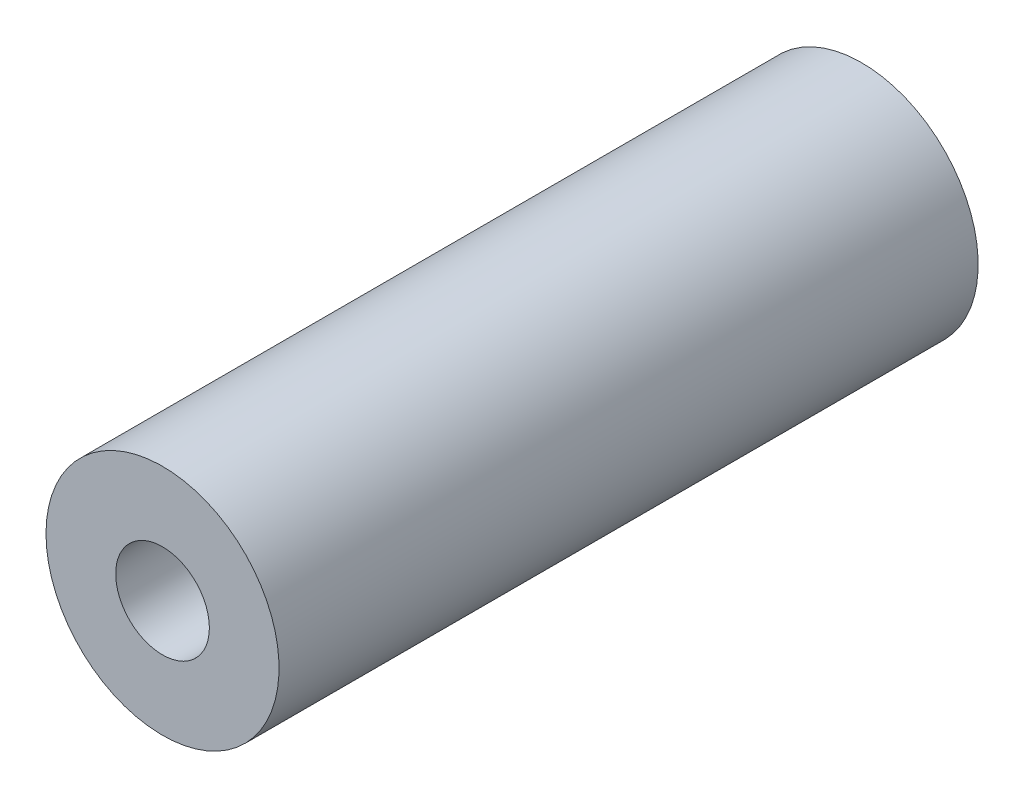
ISO-10303-21;
HEADER;
FILE_DESCRIPTION(('STEP AP214'),'2;1');
FILE_NAME('part.step','',(''),(''),'','','');
FILE_SCHEMA(('AUTOMOTIVE_DESIGN { 1 0 10303 214 1 1 1 1 }'));
ENDSEC;
DATA;
#1=APPLICATION_CONTEXT('core data for automotive mechanical design processes');
#2=APPLICATION_PROTOCOL_DEFINITION('international standard','automotive_design',2000,#1);
#3=PRODUCT_CONTEXT('',#1,'mechanical');
#4=PRODUCT('Part','Part','',(#3));
#5=PRODUCT_RELATED_PRODUCT_CATEGORY('part','',(#4));
#6=PRODUCT_DEFINITION_FORMATION('','',#4);
#7=PRODUCT_DEFINITION_CONTEXT('part definition',#1,'design');
#8=PRODUCT_DEFINITION('design','',#6,#7);
#9=PRODUCT_DEFINITION_SHAPE('','',#8);
#10=(LENGTH_UNIT() NAMED_UNIT(*) SI_UNIT(.MILLI.,.METRE.));
#11=(NAMED_UNIT(*) PLANE_ANGLE_UNIT() SI_UNIT($,.RADIAN.));
#12=(NAMED_UNIT(*) SI_UNIT($,.STERADIAN.) SOLID_ANGLE_UNIT());
#13=UNCERTAINTY_MEASURE_WITH_UNIT(LENGTH_MEASURE(1.E-05),#10,'distance_accuracy_value','');
#14=(GEOMETRIC_REPRESENTATION_CONTEXT(3) GLOBAL_UNCERTAINTY_ASSIGNED_CONTEXT((#13)) GLOBAL_UNIT_ASSIGNED_CONTEXT((#10,
#11,#12)) REPRESENTATION_CONTEXT('',''));
#15=CARTESIAN_POINT('',(0.,0.,0.));
#16=DIRECTION('',(0.,0.,1.));
#17=DIRECTION('',(1.,0.,0.));
#18=AXIS2_PLACEMENT_3D('',#15,#16,#17);
#19=CARTESIAN_POINT('',(0.,0.,38.1));
#20=DIRECTION('',(0.,0.,-1.));
#21=DIRECTION('',(-1.,0.,0.));
#22=AXIS2_PLACEMENT_3D('',#19,#20,#21);
#23=CYLINDRICAL_SURFACE('',#22,6.35);
#24=CARTESIAN_POINT('',(0.,0.,38.1));
#25=DIRECTION('',(0.,0.,1.));
#26=DIRECTION('',(1.,0.,0.));
#27=AXIS2_PLACEMENT_3D('',#24,#25,#26);
#28=CIRCLE('',#27,6.35);
#29=CARTESIAN_POINT('',(-6.35,0.,38.1));
#30=VERTEX_POINT('',#29);
#31=EDGE_CURVE('E10',#30,#30,#28,.T.);
#32=CARTESIAN_POINT('',(0.,0.,0.));
#33=DIRECTION('',(0.,0.,1.));
#34=DIRECTION('',(1.,0.,0.));
#35=AXIS2_PLACEMENT_3D('',#32,#33,#34);
#36=CIRCLE('',#35,6.35);
#37=CARTESIAN_POINT('',(-6.35,0.,0.));
#38=VERTEX_POINT('',#37);
#39=EDGE_CURVE('E45',#38,#38,#36,.T.);
#40=CARTESIAN_POINT('',(-6.35,0.,38.1));
#41=CARTESIAN_POINT('',(-6.35,0.,37.703125));
#42=CARTESIAN_POINT('',(-6.35,0.,37.30625));
#43=CARTESIAN_POINT('',(-6.35,0.,36.5125));
#44=CARTESIAN_POINT('',(-6.35,0.,36.115625));
#45=CARTESIAN_POINT('',(-6.35,0.,35.321875));
#46=CARTESIAN_POINT('',(-6.35,0.,34.925));
#47=CARTESIAN_POINT('',(-6.35,0.,34.13125));
#48=CARTESIAN_POINT('',(-6.35,0.,33.734375));
#49=CARTESIAN_POINT('',(-6.35,0.,32.940625));
#50=CARTESIAN_POINT('',(-6.35,0.,32.54375));
#51=CARTESIAN_POINT('',(-6.35,0.,31.75));
#52=CARTESIAN_POINT('',(-6.35,0.,31.353125));
#53=CARTESIAN_POINT('',(-6.35,0.,30.559375));
#54=CARTESIAN_POINT('',(-6.35,0.,30.1625));
#55=CARTESIAN_POINT('',(-6.35,0.,29.36875));
#56=CARTESIAN_POINT('',(-6.35,0.,28.971875));
#57=CARTESIAN_POINT('',(-6.35,0.,28.178125));
#58=CARTESIAN_POINT('',(-6.35,0.,27.78125));
#59=CARTESIAN_POINT('',(-6.35,0.,26.9875));
#60=CARTESIAN_POINT('',(-6.35,0.,26.590625));
#61=CARTESIAN_POINT('',(-6.35,0.,25.796875));
#62=CARTESIAN_POINT('',(-6.35,0.,25.4));
#63=CARTESIAN_POINT('',(-6.35,0.,24.60625));
#64=CARTESIAN_POINT('',(-6.35,0.,24.209375));
#65=CARTESIAN_POINT('',(-6.35,0.,23.415625));
#66=CARTESIAN_POINT('',(-6.35,0.,23.01875));
#67=CARTESIAN_POINT('',(-6.35,0.,22.225));
#68=CARTESIAN_POINT('',(-6.35,0.,21.828125));
#69=CARTESIAN_POINT('',(-6.35,0.,21.034375));
#70=CARTESIAN_POINT('',(-6.35,0.,20.6375));
#71=CARTESIAN_POINT('',(-6.35,0.,19.84375));
#72=CARTESIAN_POINT('',(-6.35,0.,19.446875));
#73=CARTESIAN_POINT('',(-6.35,0.,18.653125));
#74=CARTESIAN_POINT('',(-6.35,0.,18.25625));
#75=CARTESIAN_POINT('',(-6.35,0.,17.4625));
#76=CARTESIAN_POINT('',(-6.35,0.,17.065625));
#77=CARTESIAN_POINT('',(-6.35,0.,16.271875));
#78=CARTESIAN_POINT('',(-6.35,0.,15.875));
#79=CARTESIAN_POINT('',(-6.35,0.,15.08125));
#80=CARTESIAN_POINT('',(-6.35,0.,14.684375));
#81=CARTESIAN_POINT('',(-6.35,0.,13.890625));
#82=CARTESIAN_POINT('',(-6.35,0.,13.49375));
#83=CARTESIAN_POINT('',(-6.35,0.,12.7));
#84=CARTESIAN_POINT('',(-6.35,0.,12.303125));
#85=CARTESIAN_POINT('',(-6.35,0.,11.509375));
#86=CARTESIAN_POINT('',(-6.35,0.,11.1125));
#87=CARTESIAN_POINT('',(-6.35,0.,10.31875));
#88=CARTESIAN_POINT('',(-6.35,0.,9.921875));
#89=CARTESIAN_POINT('',(-6.35,0.,9.128125));
#90=CARTESIAN_POINT('',(-6.35,0.,8.73125));
#91=CARTESIAN_POINT('',(-6.35,0.,7.9375));
#92=CARTESIAN_POINT('',(-6.35,0.,7.540625));
#93=CARTESIAN_POINT('',(-6.35,0.,6.746875));
#94=CARTESIAN_POINT('',(-6.35,0.,6.35));
#95=CARTESIAN_POINT('',(-6.35,0.,5.55625));
#96=CARTESIAN_POINT('',(-6.35,0.,5.159375));
#97=CARTESIAN_POINT('',(-6.35,0.,4.365625));
#98=CARTESIAN_POINT('',(-6.35,0.,3.96875));
#99=CARTESIAN_POINT('',(-6.35,0.,3.175));
#100=CARTESIAN_POINT('',(-6.35,0.,2.778125));
#101=CARTESIAN_POINT('',(-6.35,0.,1.984375));
#102=CARTESIAN_POINT('',(-6.35,0.,1.5875));
#103=CARTESIAN_POINT('',(-6.35,0.,0.79375));
#104=CARTESIAN_POINT('',(-6.35,0.,0.396875));
#105=CARTESIAN_POINT('',(-6.35,0.,0.));
#106=B_SPLINE_CURVE_WITH_KNOTS('',3,(#40,#41,#42,#43,#44,#45,#46,#47,#48,#49,#50,#51,#52,#53,
#54,#55,#56,#57,#58,#59,#60,#61,#62,#63,#64,#65,#66,#67,#68,#69,#70,#71,#72,#73,#74,#75,#76,#77,
#78,#79,#80,#81,#82,#83,#84,#85,#86,#87,#88,#89,#90,#91,#92,#93,#94,#95,#96,#97,#98,#99,#100,
#101,#102,#103,#104,#105),.UNSPECIFIED.,.F.,.F.,(4,2,2,2,2,2,2,2,2,2,2,2,2,2,2,2,2,2,2,2,2,2,2,
2,2,2,2,2,2,2,2,2,4),(0.,1.19062499999999,2.38124999999999,3.571875,4.7625,5.953125,7.14375,
8.33437499999999,9.525,10.715625,11.90625,13.096875,14.2875,15.478125,16.66875,17.859375,19.05,
20.240625,21.43125,22.621875,23.8125,25.003125,26.19375,27.384375,28.575,29.765625,30.95625,
32.146875,33.3375,34.528125,35.71875,36.909375,38.1),.UNSPECIFIED.);
#107=EDGE_CURVE('BSEAM42',#30,#38,#106,.T.);
#108=ORIENTED_EDGE('',*,*,#31,.F.);
#109=ORIENTED_EDGE('',*,*,#39,.T.);
#110=ORIENTED_EDGE('',*,*,#107,.T.);
#111=ORIENTED_EDGE('',*,*,#107,.F.);
#112=EDGE_LOOP('',(#108,#110,#109,#111));
#113=FACE_BOUND('',#112,.T.);
#114=ADVANCED_FACE('F42',(#113),#23,.T.);
#115=CARTESIAN_POINT('',(0.,0.,38.1));
#116=DIRECTION('',(0.,0.,1.));
#117=DIRECTION('',(1.,0.,0.));
#118=AXIS2_PLACEMENT_3D('',#115,#116,#117);
#119=PLANE('',#118);
#120=CARTESIAN_POINT('',(0.,0.,38.1));
#121=DIRECTION('',(0.,0.,1.));
#122=DIRECTION('',(1.,0.,0.));
#123=AXIS2_PLACEMENT_3D('',#120,#121,#122);
#124=CIRCLE('',#123,2.55269999999999);
#125=CARTESIAN_POINT('',(2.55269999999999,0.,38.1));
#126=VERTEX_POINT('',#125);
#127=EDGE_CURVE('E55',#126,#126,#124,.T.);
#128=ORIENTED_EDGE('',*,*,#127,.F.);
#129=EDGE_LOOP('',(#128));
#130=FACE_BOUND('',#129,.T.);
#131=ORIENTED_EDGE('',*,*,#31,.T.);
#132=EDGE_LOOP('',(#131));
#133=FACE_BOUND('',#132,.T.);
#134=ADVANCED_FACE('F76',(#130,#133),#119,.T.);
#135=CARTESIAN_POINT('',(0.,0.,0.));
#136=DIRECTION('',(0.,0.,1.));
#137=DIRECTION('',(1.,0.,0.));
#138=AXIS2_PLACEMENT_3D('',#135,#136,#137);
#139=PLANE('',#138);
#140=CARTESIAN_POINT('',(0.,0.,0.));
#141=DIRECTION('',(0.,0.,1.));
#142=DIRECTION('',(1.,0.,0.));
#143=AXIS2_PLACEMENT_3D('',#140,#141,#142);
#144=CIRCLE('',#143,2.5527);
#145=CARTESIAN_POINT('',(2.5527,0.,0.));
#146=VERTEX_POINT('',#145);
#147=EDGE_CURVE('E60',#146,#146,#144,.T.);
#148=ORIENTED_EDGE('',*,*,#147,.T.);
#149=EDGE_LOOP('',(#148));
#150=FACE_BOUND('',#149,.T.);
#151=ORIENTED_EDGE('',*,*,#39,.F.);
#152=EDGE_LOOP('',(#151));
#153=FACE_BOUND('',#152,.T.);
#154=ADVANCED_FACE('F66',(#150,#153),#139,.F.);
#155=CARTESIAN_POINT('',(0.,0.,38.1));
#156=DIRECTION('',(0.,0.,1.));
#157=DIRECTION('',(1.,0.,0.));
#158=AXIS2_PLACEMENT_3D('',#155,#156,#157);
#159=CYLINDRICAL_SURFACE('',#158,2.55269999999999);
#160=ORIENTED_EDGE('',*,*,#127,.T.);
#161=EDGE_LOOP('',(#160));
#162=FACE_BOUND('',#161,.T.);
#163=ORIENTED_EDGE('',*,*,#147,.F.);
#164=EDGE_LOOP('',(#163));
#165=FACE_BOUND('',#164,.T.);
#166=ADVANCED_FACE('F69',(#162,#165),#159,.F.);
#167=CLOSED_SHELL('',(#114,#134,#154,#166));
#168=MANIFOLD_SOLID_BREP('B2',#167);
#169=ADVANCED_BREP_SHAPE_REPRESENTATION('',(#18,#168),#14);
#170=SHAPE_DEFINITION_REPRESENTATION(#9,#169);
ENDSEC;
END-ISO-10303-21;
